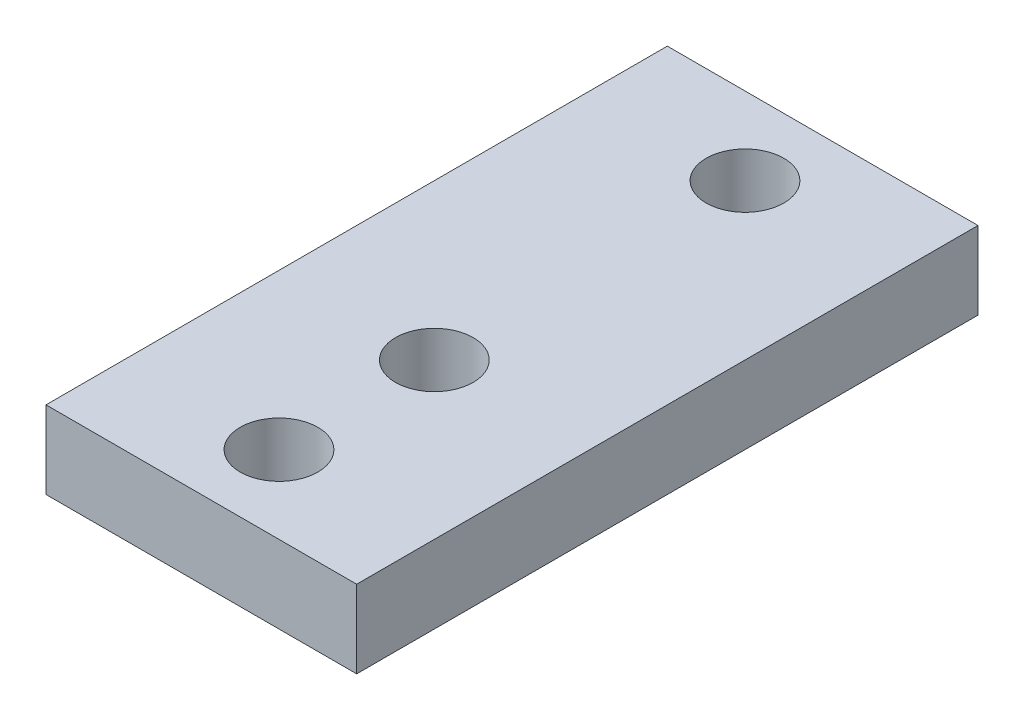
ISO-10303-21;
HEADER;
FILE_DESCRIPTION(('STEP AP214'),'2;1');
FILE_NAME('part.step','',(''),(''),'','','');
FILE_SCHEMA(('AUTOMOTIVE_DESIGN { 1 0 10303 214 1 1 1 1 }'));
ENDSEC;
DATA;
#1=APPLICATION_CONTEXT('core data for automotive mechanical design processes');
#2=APPLICATION_PROTOCOL_DEFINITION('international standard','automotive_design',2000,#1);
#3=PRODUCT_CONTEXT('',#1,'mechanical');
#4=PRODUCT('Part','Part','',(#3));
#5=PRODUCT_RELATED_PRODUCT_CATEGORY('part','',(#4));
#6=PRODUCT_DEFINITION_FORMATION('','',#4);
#7=PRODUCT_DEFINITION_CONTEXT('part definition',#1,'design');
#8=PRODUCT_DEFINITION('design','',#6,#7);
#9=PRODUCT_DEFINITION_SHAPE('','',#8);
#10=(LENGTH_UNIT() NAMED_UNIT(*) SI_UNIT(.MILLI.,.METRE.));
#11=(NAMED_UNIT(*) PLANE_ANGLE_UNIT() SI_UNIT($,.RADIAN.));
#12=(NAMED_UNIT(*) SI_UNIT($,.STERADIAN.) SOLID_ANGLE_UNIT());
#13=UNCERTAINTY_MEASURE_WITH_UNIT(LENGTH_MEASURE(1.E-05),#10,'distance_accuracy_value','');
#14=(GEOMETRIC_REPRESENTATION_CONTEXT(3) GLOBAL_UNCERTAINTY_ASSIGNED_CONTEXT((#13)) GLOBAL_UNIT_ASSIGNED_CONTEXT((#10,
#11,#12)) REPRESENTATION_CONTEXT('',''));
#15=CARTESIAN_POINT('',(0.,0.,0.));
#16=DIRECTION('',(0.,0.,1.));
#17=DIRECTION('',(1.,0.,0.));
#18=AXIS2_PLACEMENT_3D('',#15,#16,#17);
#19=CARTESIAN_POINT('',(0.,6.35,0.));
#20=DIRECTION('',(0.,1.,0.));
#21=DIRECTION('',(0.,0.,1.));
#22=AXIS2_PLACEMENT_3D('',#19,#20,#21);
#23=PLANE('',#22);
#24=CARTESIAN_POINT('',(0.,6.35,6.35));
#25=DIRECTION('',(0.,1.,0.));
#26=DIRECTION('',(0.,0.,1.));
#27=AXIS2_PLACEMENT_3D('',#24,#25,#26);
#28=CIRCLE('',#27,3.175);
#29=CARTESIAN_POINT('',(0.,6.35,9.525));
#30=VERTEX_POINT('',#29);
#31=EDGE_CURVE('E119',#30,#30,#28,.T.);
#32=ORIENTED_EDGE('',*,*,#31,.F.);
#33=EDGE_LOOP('',(#32));
#34=FACE_BOUND('',#33,.T.);
#35=DIRECTION('',(0.,0.,-1.));
#36=VECTOR('',#35,1.);
#37=CARTESIAN_POINT('',(12.7,6.35,-25.4));
#38=LINE('',#37,#36);
#39=CARTESIAN_POINT('',(12.7,6.35,25.4));
#40=VERTEX_POINT('',#39);
#41=CARTESIAN_POINT('',(12.7,6.35,-25.4));
#42=VERTEX_POINT('',#41);
#43=EDGE_CURVE('E89',#40,#42,#38,.T.);
#44=ORIENTED_EDGE('',*,*,#43,.T.);
#45=DIRECTION('',(-1.,0.,0.));
#46=VECTOR('',#45,1.);
#47=CARTESIAN_POINT('',(-12.7,6.35,-25.4));
#48=LINE('',#47,#46);
#49=CARTESIAN_POINT('',(-12.7,6.35,-25.4));
#50=VERTEX_POINT('',#49);
#51=EDGE_CURVE('E84',#42,#50,#48,.T.);
#52=ORIENTED_EDGE('',*,*,#51,.T.);
#53=DIRECTION('',(0.,0.,1.));
#54=VECTOR('',#53,1.);
#55=CARTESIAN_POINT('',(-12.7,6.35,-25.4));
#56=LINE('',#55,#54);
#57=CARTESIAN_POINT('',(-12.7,6.35,25.4));
#58=VERTEX_POINT('',#57);
#59=EDGE_CURVE('E87',#50,#58,#56,.T.);
#60=ORIENTED_EDGE('',*,*,#59,.T.);
#61=DIRECTION('',(1.,0.,0.));
#62=VECTOR('',#61,1.);
#63=CARTESIAN_POINT('',(-12.7,6.35,25.4));
#64=LINE('',#63,#62);
#65=EDGE_CURVE('E54',#58,#40,#64,.T.);
#66=ORIENTED_EDGE('',*,*,#65,.T.);
#67=EDGE_LOOP('',(#44,#52,#60,#66));
#68=FACE_BOUND('',#67,.T.);
#69=CARTESIAN_POINT('',(0.,6.35,19.05));
#70=DIRECTION('',(0.,1.,0.));
#71=DIRECTION('',(0.,0.,1.));
#72=AXIS2_PLACEMENT_3D('',#69,#70,#71);
#73=CIRCLE('',#72,3.175);
#74=CARTESIAN_POINT('',(0.,6.35,22.225));
#75=VERTEX_POINT('',#74);
#76=EDGE_CURVE('E104',#75,#75,#73,.T.);
#77=ORIENTED_EDGE('',*,*,#76,.F.);
#78=EDGE_LOOP('',(#77));
#79=FACE_BOUND('',#78,.T.);
#80=CARTESIAN_POINT('',(0.,6.35,-19.05));
#81=DIRECTION('',(0.,1.,0.));
#82=DIRECTION('',(0.,0.,1.));
#83=AXIS2_PLACEMENT_3D('',#80,#81,#82);
#84=CIRCLE('',#83,3.175);
#85=CARTESIAN_POINT('',(0.,6.35,-15.875));
#86=VERTEX_POINT('',#85);
#87=EDGE_CURVE('E125',#86,#86,#84,.T.);
#88=ORIENTED_EDGE('',*,*,#87,.F.);
#89=EDGE_LOOP('',(#88));
#90=FACE_BOUND('',#89,.T.);
#91=ADVANCED_FACE('F37',(#34,#68,#79,#90),#23,.T.);
#92=CARTESIAN_POINT('',(0.,0.,0.));
#93=DIRECTION('',(0.,1.,0.));
#94=DIRECTION('',(0.,0.,1.));
#95=AXIS2_PLACEMENT_3D('',#92,#93,#94);
#96=PLANE('',#95);
#97=DIRECTION('',(0.,0.,-1.));
#98=VECTOR('',#97,1.);
#99=CARTESIAN_POINT('',(12.7,0.,-25.4));
#100=LINE('',#99,#98);
#101=CARTESIAN_POINT('',(12.7,0.,25.4));
#102=VERTEX_POINT('',#101);
#103=CARTESIAN_POINT('',(12.7,0.,-25.4));
#104=VERTEX_POINT('',#103);
#105=EDGE_CURVE('E101',#102,#104,#100,.T.);
#106=ORIENTED_EDGE('',*,*,#105,.F.);
#107=DIRECTION('',(1.,0.,0.));
#108=VECTOR('',#107,1.);
#109=CARTESIAN_POINT('',(-12.7,0.,25.4));
#110=LINE('',#109,#108);
#111=CARTESIAN_POINT('',(-12.7,0.,25.4));
#112=VERTEX_POINT('',#111);
#113=EDGE_CURVE('E77',#112,#102,#110,.T.);
#114=ORIENTED_EDGE('',*,*,#113,.F.);
#115=DIRECTION('',(0.,0.,1.));
#116=VECTOR('',#115,1.);
#117=CARTESIAN_POINT('',(-12.7,0.,-25.4));
#118=LINE('',#117,#116);
#119=CARTESIAN_POINT('',(-12.7,0.,-25.4));
#120=VERTEX_POINT('',#119);
#121=EDGE_CURVE('E71',#120,#112,#118,.T.);
#122=ORIENTED_EDGE('',*,*,#121,.F.);
#123=DIRECTION('',(-1.,0.,0.));
#124=VECTOR('',#123,1.);
#125=CARTESIAN_POINT('',(-12.7,0.,-25.4));
#126=LINE('',#125,#124);
#127=EDGE_CURVE('E93',#104,#120,#126,.T.);
#128=ORIENTED_EDGE('',*,*,#127,.F.);
#129=EDGE_LOOP('',(#106,#114,#122,#128));
#130=FACE_BOUND('',#129,.T.);
#131=CARTESIAN_POINT('',(0.,0.,19.05));
#132=DIRECTION('',(0.,1.,0.));
#133=DIRECTION('',(0.,0.,1.));
#134=AXIS2_PLACEMENT_3D('',#131,#132,#133);
#135=CIRCLE('',#134,3.175);
#136=CARTESIAN_POINT('',(0.,0.,22.225));
#137=VERTEX_POINT('',#136);
#138=EDGE_CURVE('E116',#137,#137,#135,.T.);
#139=ORIENTED_EDGE('',*,*,#138,.T.);
#140=EDGE_LOOP('',(#139));
#141=FACE_BOUND('',#140,.T.);
#142=CARTESIAN_POINT('',(0.,0.,6.35));
#143=DIRECTION('',(0.,1.,0.));
#144=DIRECTION('',(0.,0.,1.));
#145=AXIS2_PLACEMENT_3D('',#142,#143,#144);
#146=CIRCLE('',#145,3.175);
#147=CARTESIAN_POINT('',(0.,0.,9.525));
#148=VERTEX_POINT('',#147);
#149=EDGE_CURVE('E122',#148,#148,#146,.T.);
#150=ORIENTED_EDGE('',*,*,#149,.T.);
#151=EDGE_LOOP('',(#150));
#152=FACE_BOUND('',#151,.T.);
#153=CARTESIAN_POINT('',(0.,0.,-19.05));
#154=DIRECTION('',(0.,1.,0.));
#155=DIRECTION('',(0.,0.,1.));
#156=AXIS2_PLACEMENT_3D('',#153,#154,#155);
#157=CIRCLE('',#156,3.175);
#158=CARTESIAN_POINT('',(0.,0.,-15.875));
#159=VERTEX_POINT('',#158);
#160=EDGE_CURVE('E128',#159,#159,#157,.T.);
#161=ORIENTED_EDGE('',*,*,#160,.T.);
#162=EDGE_LOOP('',(#161));
#163=FACE_BOUND('',#162,.T.);
#164=ADVANCED_FACE('F112',(#130,#141,#152,#163),#96,.F.);
#165=CARTESIAN_POINT('',(12.7,6.35,-25.4));
#166=DIRECTION('',(-1.,0.,0.));
#167=DIRECTION('',(0.,0.,1.));
#168=AXIS2_PLACEMENT_3D('',#165,#166,#167);
#169=PLANE('',#168);
#170=ORIENTED_EDGE('',*,*,#105,.T.);
#171=DIRECTION('',(0.,-1.,0.));
#172=VECTOR('',#171,1.);
#173=CARTESIAN_POINT('',(12.7,6.35,-25.4));
#174=LINE('',#173,#172);
#175=EDGE_CURVE('E11',#42,#104,#174,.T.);
#176=ORIENTED_EDGE('',*,*,#175,.F.);
#177=ORIENTED_EDGE('',*,*,#43,.F.);
#178=DIRECTION('',(0.,-1.,0.));
#179=VECTOR('',#178,1.);
#180=CARTESIAN_POINT('',(12.7,6.35,25.4));
#181=LINE('',#180,#179);
#182=EDGE_CURVE('E97',#40,#102,#181,.T.);
#183=ORIENTED_EDGE('',*,*,#182,.T.);
#184=EDGE_LOOP('',(#170,#176,#177,#183));
#185=FACE_BOUND('',#184,.T.);
#186=ADVANCED_FACE('F39',(#185),#169,.F.);
#187=CARTESIAN_POINT('',(-12.7,6.35,-25.4));
#188=DIRECTION('',(0.,0.,1.));
#189=DIRECTION('',(1.,0.,0.));
#190=AXIS2_PLACEMENT_3D('',#187,#188,#189);
#191=PLANE('',#190);
#192=ORIENTED_EDGE('',*,*,#127,.T.);
#193=DIRECTION('',(0.,-1.,0.));
#194=VECTOR('',#193,1.);
#195=CARTESIAN_POINT('',(-12.7,6.35,-25.4));
#196=LINE('',#195,#194);
#197=EDGE_CURVE('E46',#50,#120,#196,.T.);
#198=ORIENTED_EDGE('',*,*,#197,.F.);
#199=ORIENTED_EDGE('',*,*,#51,.F.);
#200=ORIENTED_EDGE('',*,*,#175,.T.);
#201=EDGE_LOOP('',(#192,#198,#199,#200));
#202=FACE_BOUND('',#201,.T.);
#203=ADVANCED_FACE('F92',(#202),#191,.F.);
#204=CARTESIAN_POINT('',(-12.7,6.35,-25.4));
#205=DIRECTION('',(1.,0.,0.));
#206=DIRECTION('',(0.,0.,-1.));
#207=AXIS2_PLACEMENT_3D('',#204,#205,#206);
#208=PLANE('',#207);
#209=ORIENTED_EDGE('',*,*,#121,.T.);
#210=DIRECTION('',(0.,-1.,0.));
#211=VECTOR('',#210,1.);
#212=CARTESIAN_POINT('',(-12.7,6.35,25.4));
#213=LINE('',#212,#211);
#214=EDGE_CURVE('E94',#58,#112,#213,.T.);
#215=ORIENTED_EDGE('',*,*,#214,.F.);
#216=ORIENTED_EDGE('',*,*,#59,.F.);
#217=ORIENTED_EDGE('',*,*,#197,.T.);
#218=EDGE_LOOP('',(#209,#215,#216,#217));
#219=FACE_BOUND('',#218,.T.);
#220=ADVANCED_FACE('F95',(#219),#208,.F.);
#221=CARTESIAN_POINT('',(-12.7,6.35,25.4));
#222=DIRECTION('',(0.,0.,-1.));
#223=DIRECTION('',(-1.,0.,0.));
#224=AXIS2_PLACEMENT_3D('',#221,#222,#223);
#225=PLANE('',#224);
#226=ORIENTED_EDGE('',*,*,#113,.T.);
#227=ORIENTED_EDGE('',*,*,#182,.F.);
#228=ORIENTED_EDGE('',*,*,#65,.F.);
#229=ORIENTED_EDGE('',*,*,#214,.T.);
#230=EDGE_LOOP('',(#226,#227,#228,#229));
#231=FACE_BOUND('',#230,.T.);
#232=ADVANCED_FACE('F109',(#231),#225,.F.);
#233=CARTESIAN_POINT('',(0.,6.35,19.05));
#234=DIRECTION('',(0.,-1.,0.));
#235=DIRECTION('',(0.,0.,-1.));
#236=AXIS2_PLACEMENT_3D('',#233,#234,#235);
#237=CYLINDRICAL_SURFACE('',#236,3.175);
#238=ORIENTED_EDGE('',*,*,#76,.T.);
#239=EDGE_LOOP('',(#238));
#240=FACE_BOUND('',#239,.T.);
#241=ORIENTED_EDGE('',*,*,#138,.F.);
#242=EDGE_LOOP('',(#241));
#243=FACE_BOUND('',#242,.T.);
#244=ADVANCED_FACE('F146',(#240,#243),#237,.F.);
#245=CARTESIAN_POINT('',(0.,6.35,6.35));
#246=DIRECTION('',(0.,-1.,0.));
#247=DIRECTION('',(0.,0.,-1.));
#248=AXIS2_PLACEMENT_3D('',#245,#246,#247);
#249=CYLINDRICAL_SURFACE('',#248,3.175);
#250=ORIENTED_EDGE('',*,*,#31,.T.);
#251=EDGE_LOOP('',(#250));
#252=FACE_BOUND('',#251,.T.);
#253=ORIENTED_EDGE('',*,*,#149,.F.);
#254=EDGE_LOOP('',(#253));
#255=FACE_BOUND('',#254,.T.);
#256=ADVANCED_FACE('F200',(#252,#255),#249,.F.);
#257=CARTESIAN_POINT('',(0.,6.35,-19.05));
#258=DIRECTION('',(0.,-1.,0.));
#259=DIRECTION('',(0.,0.,-1.));
#260=AXIS2_PLACEMENT_3D('',#257,#258,#259);
#261=CYLINDRICAL_SURFACE('',#260,3.175);
#262=ORIENTED_EDGE('',*,*,#87,.T.);
#263=EDGE_LOOP('',(#262));
#264=FACE_BOUND('',#263,.T.);
#265=ORIENTED_EDGE('',*,*,#160,.F.);
#266=EDGE_LOOP('',(#265));
#267=FACE_BOUND('',#266,.T.);
#268=ADVANCED_FACE('F134',(#264,#267),#261,.F.);
#269=CLOSED_SHELL('',(#91,#164,#186,#203,#220,#232,#244,#256,#268));
#270=MANIFOLD_SOLID_BREP('B2',#269);
#271=ADVANCED_BREP_SHAPE_REPRESENTATION('',(#18,#270),#14);
#272=SHAPE_DEFINITION_REPRESENTATION(#9,#271);
ENDSEC;
END-ISO-10303-21;
